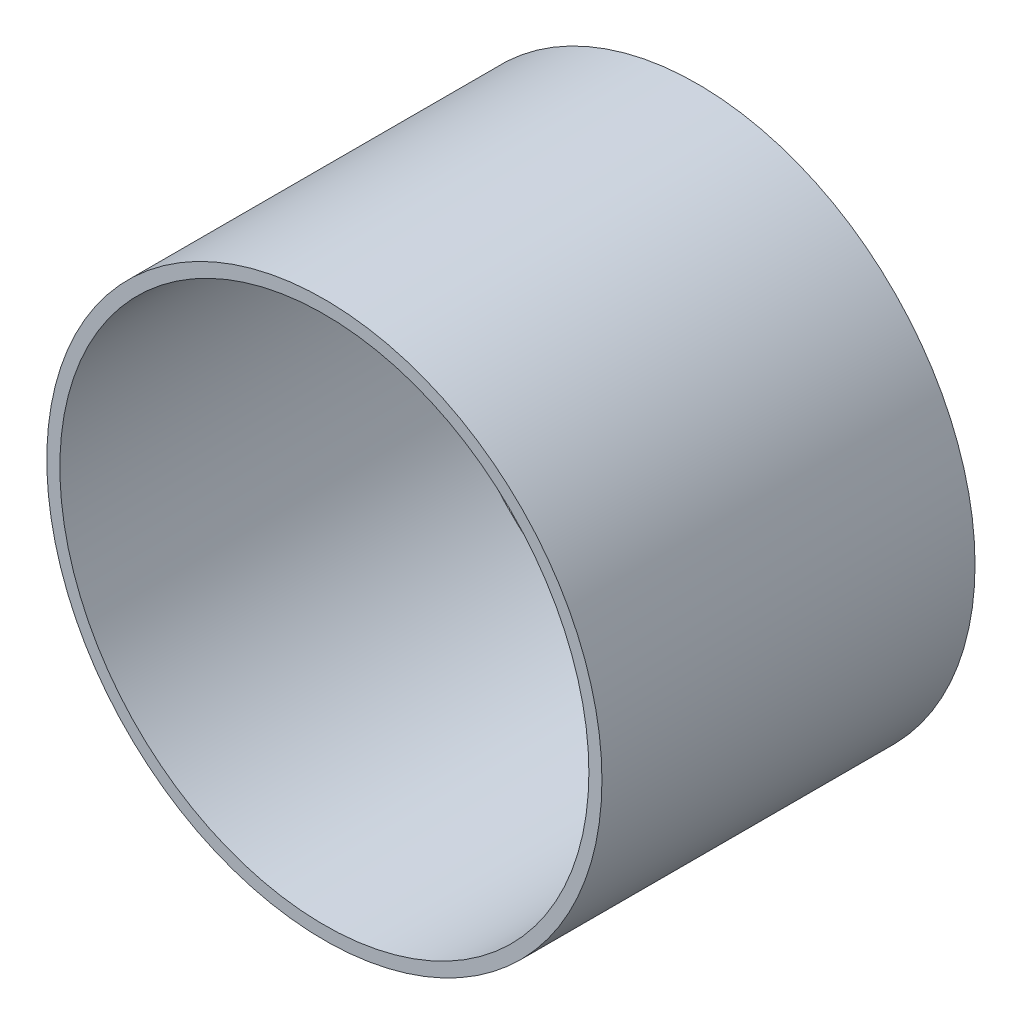
ISO-10303-21;
HEADER;
FILE_DESCRIPTION(('STEP AP214'),'2;1');
FILE_NAME('part.step','',(''),(''),'','','');
FILE_SCHEMA(('AUTOMOTIVE_DESIGN { 1 0 10303 214 1 1 1 1 }'));
ENDSEC;
DATA;
#1=APPLICATION_CONTEXT('core data for automotive mechanical design processes');
#2=APPLICATION_PROTOCOL_DEFINITION('international standard','automotive_design',2000,#1);
#3=PRODUCT_CONTEXT('',#1,'mechanical');
#4=PRODUCT('Part','Part','',(#3));
#5=PRODUCT_RELATED_PRODUCT_CATEGORY('part','',(#4));
#6=PRODUCT_DEFINITION_FORMATION('','',#4);
#7=PRODUCT_DEFINITION_CONTEXT('part definition',#1,'design');
#8=PRODUCT_DEFINITION('design','',#6,#7);
#9=PRODUCT_DEFINITION_SHAPE('','',#8);
#10=(LENGTH_UNIT() NAMED_UNIT(*) SI_UNIT(.MILLI.,.METRE.));
#11=(NAMED_UNIT(*) PLANE_ANGLE_UNIT() SI_UNIT($,.RADIAN.));
#12=(NAMED_UNIT(*) SI_UNIT($,.STERADIAN.) SOLID_ANGLE_UNIT());
#13=UNCERTAINTY_MEASURE_WITH_UNIT(LENGTH_MEASURE(1.E-05),#10,'distance_accuracy_value','');
#14=(GEOMETRIC_REPRESENTATION_CONTEXT(3) GLOBAL_UNCERTAINTY_ASSIGNED_CONTEXT((#13)) GLOBAL_UNIT_ASSIGNED_CONTEXT((#10,
#11,#12)) REPRESENTATION_CONTEXT('',''));
#15=CARTESIAN_POINT('',(0.,0.,0.));
#16=DIRECTION('',(0.,0.,1.));
#17=DIRECTION('',(1.,0.,0.));
#18=AXIS2_PLACEMENT_3D('',#15,#16,#17);
#19=CARTESIAN_POINT('',(0.,0.,0.));
#20=DIRECTION('',(0.,0.,1.));
#21=DIRECTION('',(1.,0.,0.));
#22=AXIS2_PLACEMENT_3D('',#19,#20,#21);
#23=CYLINDRICAL_SURFACE('',#22,36.0172);
#24=CARTESIAN_POINT('',(0.,0.,-50.8));
#25=DIRECTION('',(0.,0.,1.));
#26=DIRECTION('',(1.,0.,0.));
#27=AXIS2_PLACEMENT_3D('',#24,#25,#26);
#28=CIRCLE('',#27,36.0172);
#29=CARTESIAN_POINT('',(36.0172,0.,-50.8));
#30=VERTEX_POINT('',#29);
#31=EDGE_CURVE('E47',#30,#30,#28,.T.);
#32=ORIENTED_EDGE('',*,*,#31,.F.);
#33=EDGE_LOOP('',(#32));
#34=FACE_BOUND('',#33,.T.);
#35=CARTESIAN_POINT('',(0.,0.,0.));
#36=DIRECTION('',(0.,0.,1.));
#37=DIRECTION('',(1.,0.,0.));
#38=AXIS2_PLACEMENT_3D('',#35,#36,#37);
#39=CIRCLE('',#38,36.0172);
#40=CARTESIAN_POINT('',(36.0172,0.,0.));
#41=VERTEX_POINT('',#40);
#42=EDGE_CURVE('E10',#41,#41,#39,.T.);
#43=ORIENTED_EDGE('',*,*,#42,.T.);
#44=EDGE_LOOP('',(#43));
#45=FACE_BOUND('',#44,.T.);
#46=ADVANCED_FACE('F33',(#34,#45),#23,.F.);
#47=CARTESIAN_POINT('',(0.,36.0172,0.));
#48=DIRECTION('',(0.,0.,-1.));
#49=DIRECTION('',(-1.,0.,0.));
#50=AXIS2_PLACEMENT_3D('',#47,#48,#49);
#51=PLANE('',#50);
#52=ORIENTED_EDGE('',*,*,#42,.F.);
#53=EDGE_LOOP('',(#52));
#54=FACE_BOUND('',#53,.T.);
#55=CARTESIAN_POINT('',(0.,0.,0.));
#56=DIRECTION('',(0.,0.,1.));
#57=DIRECTION('',(1.,0.,0.));
#58=AXIS2_PLACEMENT_3D('',#55,#56,#57);
#59=CIRCLE('',#58,37.7952);
#60=CARTESIAN_POINT('',(37.7952,0.,0.));
#61=VERTEX_POINT('',#60);
#62=EDGE_CURVE('E39',#61,#61,#59,.T.);
#63=ORIENTED_EDGE('',*,*,#62,.T.);
#64=EDGE_LOOP('',(#63));
#65=FACE_BOUND('',#64,.T.);
#66=ADVANCED_FACE('F56',(#54,#65),#51,.F.);
#67=CARTESIAN_POINT('',(0.,0.,0.));
#68=DIRECTION('',(0.,0.,1.));
#69=DIRECTION('',(1.,0.,0.));
#70=AXIS2_PLACEMENT_3D('',#67,#68,#69);
#71=CYLINDRICAL_SURFACE('',#70,37.7952);
#72=ORIENTED_EDGE('',*,*,#62,.F.);
#73=EDGE_LOOP('',(#72));
#74=FACE_BOUND('',#73,.T.);
#75=CARTESIAN_POINT('',(0.,0.,-50.8));
#76=DIRECTION('',(0.,0.,1.));
#77=DIRECTION('',(1.,0.,0.));
#78=AXIS2_PLACEMENT_3D('',#75,#76,#77);
#79=CIRCLE('',#78,37.7952);
#80=CARTESIAN_POINT('',(37.7952,0.,-50.8));
#81=VERTEX_POINT('',#80);
#82=EDGE_CURVE('E43',#81,#81,#79,.T.);
#83=ORIENTED_EDGE('',*,*,#82,.T.);
#84=EDGE_LOOP('',(#83));
#85=FACE_BOUND('',#84,.T.);
#86=ADVANCED_FACE('F60',(#74,#85),#71,.T.);
#87=CARTESIAN_POINT('',(0.,37.7952,-50.8));
#88=DIRECTION('',(0.,0.,1.));
#89=DIRECTION('',(1.,0.,0.));
#90=AXIS2_PLACEMENT_3D('',#87,#88,#89);
#91=PLANE('',#90);
#92=ORIENTED_EDGE('',*,*,#82,.F.);
#93=EDGE_LOOP('',(#92));
#94=FACE_BOUND('',#93,.T.);
#95=ORIENTED_EDGE('',*,*,#31,.T.);
#96=EDGE_LOOP('',(#95));
#97=FACE_BOUND('',#96,.T.);
#98=ADVANCED_FACE('F53',(#94,#97),#91,.F.);
#99=CLOSED_SHELL('',(#46,#66,#86,#98));
#100=MANIFOLD_SOLID_BREP('B2',#99);
#101=ADVANCED_BREP_SHAPE_REPRESENTATION('',(#18,#100),#14);
#102=SHAPE_DEFINITION_REPRESENTATION(#9,#101);
ENDSEC;
END-ISO-10303-21;
